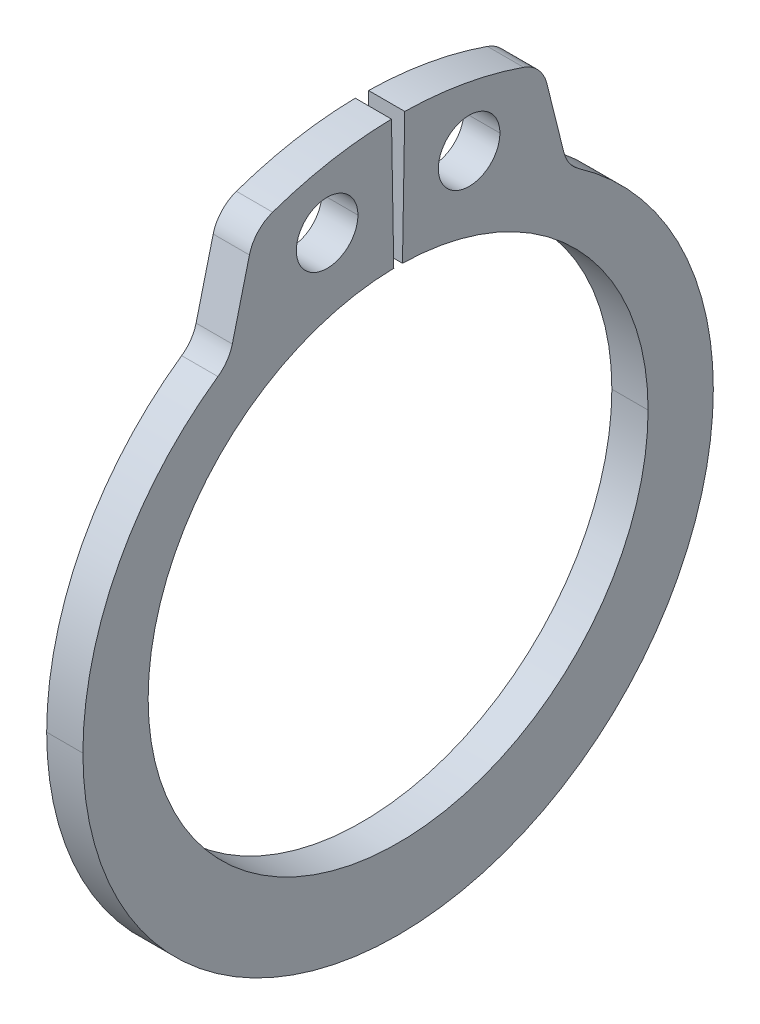
ISO-10303-21;
HEADER;
FILE_DESCRIPTION(('STEP AP214'),'2;1');
FILE_NAME('part.step','',(''),(''),'','','');
FILE_SCHEMA(('AUTOMOTIVE_DESIGN { 1 0 10303 214 1 1 1 1 }'));
ENDSEC;
DATA;
#1=APPLICATION_CONTEXT('core data for automotive mechanical design processes');
#2=APPLICATION_PROTOCOL_DEFINITION('international standard','automotive_design',2000,#1);
#3=PRODUCT_CONTEXT('',#1,'mechanical');
#4=PRODUCT('Part','Part','',(#3));
#5=PRODUCT_RELATED_PRODUCT_CATEGORY('part','',(#4));
#6=PRODUCT_DEFINITION_FORMATION('','',#4);
#7=PRODUCT_DEFINITION_CONTEXT('part definition',#1,'design');
#8=PRODUCT_DEFINITION('design','',#6,#7);
#9=PRODUCT_DEFINITION_SHAPE('','',#8);
#10=(LENGTH_UNIT() NAMED_UNIT(*) SI_UNIT(.MILLI.,.METRE.));
#11=(NAMED_UNIT(*) PLANE_ANGLE_UNIT() SI_UNIT($,.RADIAN.));
#12=(NAMED_UNIT(*) SI_UNIT($,.STERADIAN.) SOLID_ANGLE_UNIT());
#13=UNCERTAINTY_MEASURE_WITH_UNIT(LENGTH_MEASURE(1.E-05),#10,'distance_accuracy_value','');
#14=(GEOMETRIC_REPRESENTATION_CONTEXT(3) GLOBAL_UNCERTAINTY_ASSIGNED_CONTEXT((#13)) GLOBAL_UNIT_ASSIGNED_CONTEXT((#10,
#11,#12)) REPRESENTATION_CONTEXT('',''));
#15=CARTESIAN_POINT('',(0.,0.,0.));
#16=DIRECTION('',(0.,0.,1.));
#17=DIRECTION('',(1.,0.,0.));
#18=AXIS2_PLACEMENT_3D('',#15,#16,#17);
#19=CARTESIAN_POINT('',(0.5,7.55953720484558,-5.54645551751437));
#20=DIRECTION('',(-1.,0.,0.));
#21=DIRECTION('',(0.,0.,1.));
#22=AXIS2_PLACEMENT_3D('',#19,#20,#21);
#23=CYLINDRICAL_SURFACE('',#22,1.);
#24=CARTESIAN_POINT('',(0.5,7.55953720484558,-5.54645551751437));
#25=DIRECTION('',(-1.,0.,0.));
#26=DIRECTION('',(0.,0.,-1.));
#27=AXIS2_PLACEMENT_3D('',#24,#25,#26);
#28=CIRCLE('',#27,1.);
#29=CARTESIAN_POINT('',(0.5,6.73911195964234,-4.97470170945254));
#30=VERTEX_POINT('',#29);
#31=CARTESIAN_POINT('',(0.5,7.31761530924591,-4.57615979123837));
#32=VERTEX_POINT('',#31);
#33=EDGE_CURVE('E233',#30,#32,#28,.T.);
#34=ORIENTED_EDGE('',*,*,#33,.F.);
#35=DIRECTION('',(1.,0.,0.));
#36=VECTOR('',#35,1.);
#37=CARTESIAN_POINT('',(0.5,6.73911195964234,-4.97470170945254));
#38=LINE('',#37,#36);
#39=CARTESIAN_POINT('',(-0.5,6.73911195964234,-4.97470170945254));
#40=VERTEX_POINT('',#39);
#41=EDGE_CURVE('E393',#40,#30,#38,.T.);
#42=ORIENTED_EDGE('',*,*,#41,.F.);
#43=CARTESIAN_POINT('',(-0.5,7.55953720484558,-5.54645551751437));
#44=DIRECTION('',(1.,0.,0.));
#45=DIRECTION('',(0.,0.,-1.));
#46=AXIS2_PLACEMENT_3D('',#43,#44,#45);
#47=CIRCLE('',#46,1.);
#48=CARTESIAN_POINT('',(-0.5,7.31761530924591,-4.57615979123837));
#49=VERTEX_POINT('',#48);
#50=EDGE_CURVE('E257',#49,#40,#47,.T.);
#51=ORIENTED_EDGE('',*,*,#50,.F.);
#52=DIRECTION('',(-1.,0.,0.));
#53=VECTOR('',#52,1.);
#54=CARTESIAN_POINT('',(-0.5,7.31761530924592,-4.57615979123837));
#55=LINE('',#54,#53);
#56=EDGE_CURVE('E212',#32,#49,#55,.T.);
#57=ORIENTED_EDGE('',*,*,#56,.F.);
#58=EDGE_LOOP('',(#34,#42,#51,#57));
#59=FACE_BOUND('',#58,.T.);
#60=ADVANCED_FACE('F16',(#59),#23,.F.);
#61=CARTESIAN_POINT('',(0.5,8.96816184312503,-3.13401869099666));
#62=DIRECTION('',(-1.,0.,0.));
#63=DIRECTION('',(0.,0.,1.));
#64=AXIS2_PLACEMENT_3D('',#61,#62,#63);
#65=CYLINDRICAL_SURFACE('',#64,1.);
#66=CARTESIAN_POINT('',(0.5,8.96816184312503,-3.13401869099666));
#67=DIRECTION('',(1.,0.,0.));
#68=DIRECTION('',(0.,0.,-1.));
#69=AXIS2_PLACEMENT_3D('',#66,#67,#68);
#70=CIRCLE('',#69,1.);
#71=CARTESIAN_POINT('',(0.5,9.21008373872469,-4.10431441727265));
#72=VERTEX_POINT('',#71);
#73=CARTESIAN_POINT('',(0.5,9.91217887924345,-3.46391539531209));
#74=VERTEX_POINT('',#73);
#75=EDGE_CURVE('E204',#72,#74,#70,.T.);
#76=ORIENTED_EDGE('',*,*,#75,.F.);
#77=DIRECTION('',(1.,0.,0.));
#78=VECTOR('',#77,1.);
#79=CARTESIAN_POINT('',(0.5,9.21008373872469,-4.10431441727265));
#80=LINE('',#79,#78);
#81=CARTESIAN_POINT('',(-0.5,9.21008373872469,-4.10431441727265));
#82=VERTEX_POINT('',#81);
#83=EDGE_CURVE('E320',#82,#72,#80,.T.);
#84=ORIENTED_EDGE('',*,*,#83,.F.);
#85=CARTESIAN_POINT('',(-0.5,8.96816184312503,-3.13401869099666));
#86=DIRECTION('',(-1.,0.,0.));
#87=DIRECTION('',(0.,0.,-1.));
#88=AXIS2_PLACEMENT_3D('',#85,#86,#87);
#89=CIRCLE('',#88,1.);
#90=CARTESIAN_POINT('',(-0.5,9.91217887924345,-3.46391539531209));
#91=VERTEX_POINT('',#90);
#92=EDGE_CURVE('E207',#91,#82,#89,.T.);
#93=ORIENTED_EDGE('',*,*,#92,.F.);
#94=DIRECTION('',(-1.,0.,0.));
#95=VECTOR('',#94,1.);
#96=CARTESIAN_POINT('',(0.5,9.91217887924345,-3.46391539531209));
#97=LINE('',#96,#95);
#98=EDGE_CURVE('E27',#74,#91,#97,.T.);
#99=ORIENTED_EDGE('',*,*,#98,.F.);
#100=EDGE_LOOP('',(#76,#84,#93,#99));
#101=FACE_BOUND('',#100,.T.);
#102=ADVANCED_FACE('F202',(#101),#65,.T.);
#103=CARTESIAN_POINT('',(0.5,8.96816184312503,3.13401869099666));
#104=DIRECTION('',(-1.,0.,0.));
#105=DIRECTION('',(0.,0.,1.));
#106=AXIS2_PLACEMENT_3D('',#103,#104,#105);
#107=CYLINDRICAL_SURFACE('',#106,1.);
#108=CARTESIAN_POINT('',(0.5,8.96816184312503,3.13401869099666));
#109=DIRECTION('',(1.,0.,0.));
#110=DIRECTION('',(0.,0.,-1.));
#111=AXIS2_PLACEMENT_3D('',#108,#109,#110);
#112=CIRCLE('',#111,1.);
#113=CARTESIAN_POINT('',(0.5,9.91217887924345,3.46391539531209));
#114=VERTEX_POINT('',#113);
#115=CARTESIAN_POINT('',(0.5,9.21008373872469,4.10431441727265));
#116=VERTEX_POINT('',#115);
#117=EDGE_CURVE('E264',#114,#116,#112,.T.);
#118=ORIENTED_EDGE('',*,*,#117,.F.);
#119=DIRECTION('',(1.,0.,0.));
#120=VECTOR('',#119,1.);
#121=CARTESIAN_POINT('',(0.5,9.91217887924345,3.46391539531209));
#122=LINE('',#121,#120);
#123=CARTESIAN_POINT('',(-0.5,9.91217887924345,3.46391539531209));
#124=VERTEX_POINT('',#123);
#125=EDGE_CURVE('E327',#124,#114,#122,.T.);
#126=ORIENTED_EDGE('',*,*,#125,.F.);
#127=CARTESIAN_POINT('',(-0.5,8.96816184312503,3.13401869099666));
#128=DIRECTION('',(-1.,0.,0.));
#129=DIRECTION('',(0.,0.,-1.));
#130=AXIS2_PLACEMENT_3D('',#127,#128,#129);
#131=CIRCLE('',#130,1.);
#132=CARTESIAN_POINT('',(-0.5,9.21008373872469,4.10431441727265));
#133=VERTEX_POINT('',#132);
#134=EDGE_CURVE('E272',#133,#124,#131,.T.);
#135=ORIENTED_EDGE('',*,*,#134,.F.);
#136=DIRECTION('',(-1.,0.,0.));
#137=VECTOR('',#136,1.);
#138=CARTESIAN_POINT('',(0.5,9.21008373872469,4.10431441727265));
#139=LINE('',#138,#137);
#140=EDGE_CURVE('E161',#116,#133,#139,.T.);
#141=ORIENTED_EDGE('',*,*,#140,.F.);
#142=EDGE_LOOP('',(#118,#126,#135,#141));
#143=FACE_BOUND('',#142,.T.);
#144=ADVANCED_FACE('F664',(#143),#107,.T.);
#145=CARTESIAN_POINT('',(0.5,7.55953720484558,5.54645551751436));
#146=DIRECTION('',(-1.,0.,0.));
#147=DIRECTION('',(0.,0.,1.));
#148=AXIS2_PLACEMENT_3D('',#145,#146,#147);
#149=CYLINDRICAL_SURFACE('',#148,1.);
#150=CARTESIAN_POINT('',(0.5,7.55953720484558,5.54645551751436));
#151=DIRECTION('',(-1.,0.,0.));
#152=DIRECTION('',(0.,0.,-1.));
#153=AXIS2_PLACEMENT_3D('',#150,#151,#152);
#154=CIRCLE('',#153,1.);
#155=CARTESIAN_POINT('',(0.5,7.31761530924592,4.57615979123836));
#156=VERTEX_POINT('',#155);
#157=CARTESIAN_POINT('',(0.5,6.73911195964234,4.97470170945253));
#158=VERTEX_POINT('',#157);
#159=EDGE_CURVE('E336',#156,#158,#154,.T.);
#160=ORIENTED_EDGE('',*,*,#159,.F.);
#161=DIRECTION('',(1.,0.,0.));
#162=VECTOR('',#161,1.);
#163=CARTESIAN_POINT('',(0.5,7.31761530924592,4.57615979123836));
#164=LINE('',#163,#162);
#165=CARTESIAN_POINT('',(-0.5,7.31761530924592,4.57615979123836));
#166=VERTEX_POINT('',#165);
#167=EDGE_CURVE('E324',#166,#156,#164,.T.);
#168=ORIENTED_EDGE('',*,*,#167,.F.);
#169=CARTESIAN_POINT('',(-0.5,7.55953720484558,5.54645551751436));
#170=DIRECTION('',(1.,0.,0.));
#171=DIRECTION('',(0.,0.,-1.));
#172=AXIS2_PLACEMENT_3D('',#169,#170,#171);
#173=CIRCLE('',#172,1.);
#174=CARTESIAN_POINT('',(-0.5,6.73911195964234,4.97470170945253));
#175=VERTEX_POINT('',#174);
#176=EDGE_CURVE('E256',#175,#166,#173,.T.);
#177=ORIENTED_EDGE('',*,*,#176,.F.);
#178=DIRECTION('',(-1.,0.,0.));
#179=VECTOR('',#178,1.);
#180=CARTESIAN_POINT('',(0.5,6.73911195964234,4.97470170945253));
#181=LINE('',#180,#179);
#182=EDGE_CURVE('E42',#158,#175,#181,.T.);
#183=ORIENTED_EDGE('',*,*,#182,.F.);
#184=EDGE_LOOP('',(#160,#168,#177,#183));
#185=FACE_BOUND('',#184,.T.);
#186=ADVANCED_FACE('F659',(#185),#149,.F.);
#187=CARTESIAN_POINT('',(0.5,8.66711980549087,-1.9596288316201));
#188=DIRECTION('',(-1.,0.,0.));
#189=DIRECTION('',(0.,0.,1.));
#190=AXIS2_PLACEMENT_3D('',#187,#188,#189);
#191=CYLINDRICAL_SURFACE('',#190,0.85);
#192=DIRECTION('',(-1.,0.,0.));
#193=VECTOR('',#192,1.);
#194=CARTESIAN_POINT('',(0.5,8.66711980549087,-2.8096288316201));
#195=LINE('',#194,#193);
#196=CARTESIAN_POINT('',(0.5,8.66711980549087,-2.8096288316201));
#197=VERTEX_POINT('',#196);
#198=CARTESIAN_POINT('',(-0.5,8.66711980549087,-2.8096288316201));
#199=VERTEX_POINT('',#198);
#200=EDGE_CURVE('E332',#197,#199,#195,.T.);
#201=ORIENTED_EDGE('',*,*,#200,.F.);
#202=CARTESIAN_POINT('',(0.5,8.66711980549087,-1.9596288316201));
#203=DIRECTION('',(1.,0.,0.));
#204=DIRECTION('',(0.,0.,-1.));
#205=AXIS2_PLACEMENT_3D('',#202,#203,#204);
#206=CIRCLE('',#205,0.85);
#207=CARTESIAN_POINT('',(0.5,8.66711980549087,-1.1096288316201));
#208=VERTEX_POINT('',#207);
#209=EDGE_CURVE('E273',#197,#208,#206,.T.);
#210=ORIENTED_EDGE('',*,*,#209,.T.);
#211=DIRECTION('',(-1.,0.,0.));
#212=VECTOR('',#211,1.);
#213=CARTESIAN_POINT('',(0.5,8.66711980549087,-1.1096288316201));
#214=LINE('',#213,#212);
#215=CARTESIAN_POINT('',(-0.5,8.66711980549087,-1.1096288316201));
#216=VERTEX_POINT('',#215);
#217=EDGE_CURVE('E258',#208,#216,#214,.T.);
#218=ORIENTED_EDGE('',*,*,#217,.T.);
#219=CARTESIAN_POINT('',(-0.5,8.66711980549087,-1.9596288316201));
#220=DIRECTION('',(1.,0.,0.));
#221=DIRECTION('',(0.,0.,-1.));
#222=AXIS2_PLACEMENT_3D('',#219,#220,#221);
#223=CIRCLE('',#222,0.85);
#224=EDGE_CURVE('E349',#199,#216,#223,.T.);
#225=ORIENTED_EDGE('',*,*,#224,.F.);
#226=EDGE_LOOP('',(#201,#210,#218,#225));
#227=FACE_BOUND('',#226,.T.);
#228=ADVANCED_FACE('F663',(#227),#191,.F.);
#229=CARTESIAN_POINT('',(0.5,8.66711980549087,1.9596288316201));
#230=DIRECTION('',(-1.,0.,0.));
#231=DIRECTION('',(0.,0.,1.));
#232=AXIS2_PLACEMENT_3D('',#229,#230,#231);
#233=CYLINDRICAL_SURFACE('',#232,0.85);
#234=DIRECTION('',(-1.,0.,0.));
#235=VECTOR('',#234,1.);
#236=CARTESIAN_POINT('',(0.5,8.66711980549087,1.1096288316201));
#237=LINE('',#236,#235);
#238=CARTESIAN_POINT('',(0.5,8.66711980549087,1.1096288316201));
#239=VERTEX_POINT('',#238);
#240=CARTESIAN_POINT('',(-0.5,8.66711980549087,1.1096288316201));
#241=VERTEX_POINT('',#240);
#242=EDGE_CURVE('E277',#239,#241,#237,.T.);
#243=ORIENTED_EDGE('',*,*,#242,.F.);
#244=CARTESIAN_POINT('',(0.5,8.66711980549087,1.9596288316201));
#245=DIRECTION('',(1.,0.,0.));
#246=DIRECTION('',(0.,0.,-1.));
#247=AXIS2_PLACEMENT_3D('',#244,#245,#246);
#248=CIRCLE('',#247,0.85);
#249=CARTESIAN_POINT('',(0.5,8.66711980549087,2.8096288316201));
#250=VERTEX_POINT('',#249);
#251=EDGE_CURVE('E323',#239,#250,#248,.T.);
#252=ORIENTED_EDGE('',*,*,#251,.T.);
#253=DIRECTION('',(-1.,0.,0.));
#254=VECTOR('',#253,1.);
#255=CARTESIAN_POINT('',(0.5,8.66711980549087,2.8096288316201));
#256=LINE('',#255,#254);
#257=CARTESIAN_POINT('',(-0.5,8.66711980549087,2.8096288316201));
#258=VERTEX_POINT('',#257);
#259=EDGE_CURVE('E247',#250,#258,#256,.T.);
#260=ORIENTED_EDGE('',*,*,#259,.T.);
#261=CARTESIAN_POINT('',(-0.5,8.66711980549087,1.9596288316201));
#262=DIRECTION('',(1.,0.,0.));
#263=DIRECTION('',(0.,0.,-1.));
#264=AXIS2_PLACEMENT_3D('',#261,#262,#263);
#265=CIRCLE('',#264,0.85);
#266=EDGE_CURVE('E361',#241,#258,#265,.T.);
#267=ORIENTED_EDGE('',*,*,#266,.F.);
#268=EDGE_LOOP('',(#243,#252,#260,#267));
#269=FACE_BOUND('',#268,.T.);
#270=ADVANCED_FACE('F680',(#269),#233,.F.);
#271=CARTESIAN_POINT('',(0.5,10.4984007991421,-0.183250267591479));
#272=DIRECTION('',(0.,-0.017452406437284,-0.999847695156391));
#273=DIRECTION('',(0.,-0.999847695156391,0.017452406437284));
#274=AXIS2_PLACEMENT_3D('',#271,#272,#273);
#275=PLANE('',#274);
#276=DIRECTION('',(0.,-0.999847695156391,0.017452406437284));
#277=VECTOR('',#276,1.);
#278=CARTESIAN_POINT('',(-0.5,10.4984007991421,-0.183250267591479));
#279=LINE('',#278,#277);
#280=CARTESIAN_POINT('',(-0.5,10.4984007991421,-0.183250267591479));
#281=VERTEX_POINT('',#280);
#282=CARTESIAN_POINT('',(-0.5,6.8989490965791,-0.120421604417257));
#283=VERTEX_POINT('',#282);
#284=EDGE_CURVE('E246',#281,#283,#279,.T.);
#285=ORIENTED_EDGE('',*,*,#284,.T.);
#286=DIRECTION('',(-1.,0.,0.));
#287=VECTOR('',#286,1.);
#288=CARTESIAN_POINT('',(0.5,6.8989490965791,-0.120421604417257));
#289=LINE('',#288,#287);
#290=CARTESIAN_POINT('',(0.5,6.8989490965791,-0.120421604417257));
#291=VERTEX_POINT('',#290);
#292=EDGE_CURVE('E174',#291,#283,#289,.T.);
#293=ORIENTED_EDGE('',*,*,#292,.F.);
#294=DIRECTION('',(0.,-0.999847695156391,0.017452406437284));
#295=VECTOR('',#294,1.);
#296=CARTESIAN_POINT('',(0.5,10.4984007991421,-0.183250267591479));
#297=LINE('',#296,#295);
#298=CARTESIAN_POINT('',(0.5,10.4984007991421,-0.183250267591479));
#299=VERTEX_POINT('',#298);
#300=EDGE_CURVE('E220',#299,#291,#297,.T.);
#301=ORIENTED_EDGE('',*,*,#300,.F.);
#302=DIRECTION('',(-1.,0.,0.));
#303=VECTOR('',#302,1.);
#304=CARTESIAN_POINT('',(0.5,10.4984007991421,-0.183250267591479));
#305=LINE('',#304,#303);
#306=EDGE_CURVE('E11',#299,#281,#305,.T.);
#307=ORIENTED_EDGE('',*,*,#306,.T.);
#308=EDGE_LOOP('',(#285,#293,#301,#307));
#309=FACE_BOUND('',#308,.T.);
#310=ADVANCED_FACE('F689',(#309),#275,.F.);
#311=CARTESIAN_POINT('',(0.5,0.,0.));
#312=DIRECTION('',(-1.,0.,0.));
#313=DIRECTION('',(0.,0.,1.));
#314=AXIS2_PLACEMENT_3D('',#311,#312,#313);
#315=CYLINDRICAL_SURFACE('',#314,10.5);
#316=CARTESIAN_POINT('',(0.5,0.,0.));
#317=DIRECTION('',(1.,0.,0.));
#318=DIRECTION('',(0.,0.,1.));
#319=AXIS2_PLACEMENT_3D('',#316,#317,#318);
#320=CIRCLE('',#319,10.5);
#321=EDGE_CURVE('E215',#74,#299,#320,.T.);
#322=ORIENTED_EDGE('',*,*,#321,.F.);
#323=ORIENTED_EDGE('',*,*,#98,.T.);
#324=CARTESIAN_POINT('',(-0.5,0.,0.));
#325=DIRECTION('',(1.,0.,0.));
#326=DIRECTION('',(0.,0.,1.));
#327=AXIS2_PLACEMENT_3D('',#324,#325,#326);
#328=CIRCLE('',#327,10.5);
#329=EDGE_CURVE('E370',#91,#281,#328,.T.);
#330=ORIENTED_EDGE('',*,*,#329,.T.);
#331=ORIENTED_EDGE('',*,*,#306,.F.);
#332=EDGE_LOOP('',(#322,#323,#330,#331));
#333=FACE_BOUND('',#332,.T.);
#334=ADVANCED_FACE('F216',(#333),#315,.T.);
#335=CARTESIAN_POINT('',(0.5,9.7173447274592,-3.97784004803122));
#336=DIRECTION('',(0.,-0.241921895599666,0.970295726275997));
#337=DIRECTION('',(-1.,0.,0.));
#338=AXIS2_PLACEMENT_3D('',#335,#336,#337);
#339=PLANE('',#338);
#340=DIRECTION('',(0.,0.970295726275997,0.241921895599666));
#341=VECTOR('',#340,1.);
#342=CARTESIAN_POINT('',(-0.5,9.7173447274592,-3.97784004803122));
#343=LINE('',#342,#341);
#344=EDGE_CURVE('E354',#49,#82,#343,.T.);
#345=ORIENTED_EDGE('',*,*,#344,.T.);
#346=ORIENTED_EDGE('',*,*,#83,.T.);
#347=DIRECTION('',(0.,0.970295726275997,0.241921895599666));
#348=VECTOR('',#347,1.);
#349=CARTESIAN_POINT('',(0.5,9.7173447274592,-3.97784004803122));
#350=LINE('',#349,#348);
#351=EDGE_CURVE('E225',#32,#72,#350,.T.);
#352=ORIENTED_EDGE('',*,*,#351,.F.);
#353=ORIENTED_EDGE('',*,*,#56,.T.);
#354=EDGE_LOOP('',(#345,#346,#352,#353));
#355=FACE_BOUND('',#354,.T.);
#356=ADVANCED_FACE('F643',(#355),#339,.F.);
#357=CARTESIAN_POINT('',(0.5,-0.399224177769539,0.));
#358=DIRECTION('',(-1.,0.,0.));
#359=DIRECTION('',(0.,0.,1.));
#360=AXIS2_PLACEMENT_3D('',#357,#358,#359);
#361=CYLINDRICAL_SURFACE('',#360,8.70077582223047);
#362=DIRECTION('',(-1.,0.,0.));
#363=VECTOR('',#362,1.);
#364=CARTESIAN_POINT('',(0.5,-0.399224177769539,8.70077582223047));
#365=LINE('',#364,#363);
#366=CARTESIAN_POINT('',(0.5,-0.399224177769539,8.70077582223046));
#367=VERTEX_POINT('',#366);
#368=CARTESIAN_POINT('',(-0.5,-0.399224177769539,8.70077582223046));
#369=VERTEX_POINT('',#368);
#370=EDGE_CURVE('E301',#367,#369,#365,.T.);
#371=ORIENTED_EDGE('',*,*,#370,.F.);
#372=CARTESIAN_POINT('',(0.5,-0.399224177769539,0.));
#373=DIRECTION('',(1.,0.,0.));
#374=DIRECTION('',(0.,0.,-1.));
#375=AXIS2_PLACEMENT_3D('',#372,#373,#374);
#376=CIRCLE('',#375,8.70077582223047);
#377=EDGE_CURVE('E340',#158,#367,#376,.T.);
#378=ORIENTED_EDGE('',*,*,#377,.F.);
#379=ORIENTED_EDGE('',*,*,#182,.T.);
#380=CARTESIAN_POINT('',(-0.5,-0.399224177769539,0.));
#381=DIRECTION('',(1.,0.,0.));
#382=DIRECTION('',(0.,0.,-1.));
#383=AXIS2_PLACEMENT_3D('',#380,#381,#382);
#384=CIRCLE('',#383,8.70077582223047);
#385=EDGE_CURVE('E253',#175,#369,#384,.T.);
#386=ORIENTED_EDGE('',*,*,#385,.T.);
#387=EDGE_LOOP('',(#371,#378,#379,#386));
#388=FACE_BOUND('',#387,.T.);
#389=ADVANCED_FACE('F638',(#388),#361,.T.);
#390=CARTESIAN_POINT('',(0.5,9.7173447274592,3.97784004803122));
#391=DIRECTION('',(0.,-0.241921895599666,-0.970295726275997));
#392=DIRECTION('',(0.,-0.970295726275997,0.241921895599666));
#393=AXIS2_PLACEMENT_3D('',#390,#391,#392);
#394=PLANE('',#393);
#395=DIRECTION('',(0.,-0.970295726275997,0.241921895599666));
#396=VECTOR('',#395,1.);
#397=CARTESIAN_POINT('',(-0.5,9.7173447274592,3.97784004803122));
#398=LINE('',#397,#396);
#399=EDGE_CURVE('E269',#133,#166,#398,.T.);
#400=ORIENTED_EDGE('',*,*,#399,.T.);
#401=ORIENTED_EDGE('',*,*,#167,.T.);
#402=DIRECTION('',(0.,-0.970295726275997,0.241921895599666));
#403=VECTOR('',#402,1.);
#404=CARTESIAN_POINT('',(0.5,9.7173447274592,3.97784004803122));
#405=LINE('',#404,#403);
#406=EDGE_CURVE('E237',#116,#156,#405,.T.);
#407=ORIENTED_EDGE('',*,*,#406,.F.);
#408=ORIENTED_EDGE('',*,*,#140,.T.);
#409=EDGE_LOOP('',(#400,#401,#407,#408));
#410=FACE_BOUND('',#409,.T.);
#411=ADVANCED_FACE('F634',(#410),#394,.F.);
#412=CARTESIAN_POINT('',(0.5,0.,0.));
#413=DIRECTION('',(-1.,0.,0.));
#414=DIRECTION('',(0.,0.,1.));
#415=AXIS2_PLACEMENT_3D('',#412,#413,#414);
#416=CYLINDRICAL_SURFACE('',#415,10.5);
#417=CARTESIAN_POINT('',(-0.5,0.,0.));
#418=DIRECTION('',(1.,0.,0.));
#419=DIRECTION('',(0.,0.,-1.));
#420=AXIS2_PLACEMENT_3D('',#417,#418,#419);
#421=CIRCLE('',#420,10.5);
#422=CARTESIAN_POINT('',(-0.5,10.4984007991421,0.183250267591478));
#423=VERTEX_POINT('',#422);
#424=EDGE_CURVE('E243',#423,#124,#421,.T.);
#425=ORIENTED_EDGE('',*,*,#424,.T.);
#426=ORIENTED_EDGE('',*,*,#125,.T.);
#427=CARTESIAN_POINT('',(0.5,0.,0.));
#428=DIRECTION('',(1.,0.,0.));
#429=DIRECTION('',(0.,0.,-1.));
#430=AXIS2_PLACEMENT_3D('',#427,#428,#429);
#431=CIRCLE('',#430,10.5);
#432=CARTESIAN_POINT('',(0.5,10.4984007991421,0.183250267591478));
#433=VERTEX_POINT('',#432);
#434=EDGE_CURVE('E268',#433,#114,#431,.T.);
#435=ORIENTED_EDGE('',*,*,#434,.F.);
#436=DIRECTION('',(-1.,0.,0.));
#437=VECTOR('',#436,1.);
#438=CARTESIAN_POINT('',(0.5,10.4984007991421,0.183250267591478));
#439=LINE('',#438,#437);
#440=EDGE_CURVE('E348',#433,#423,#439,.T.);
#441=ORIENTED_EDGE('',*,*,#440,.T.);
#442=EDGE_LOOP('',(#425,#426,#435,#441));
#443=FACE_BOUND('',#442,.T.);
#444=ADVANCED_FACE('F445',(#443),#416,.T.);
#445=CARTESIAN_POINT('',(0.5,6.8989490965791,0.120421604417256));
#446=DIRECTION('',(0.,-0.0174524064372836,0.999847695156391));
#447=DIRECTION('',(-1.,0.,0.));
#448=AXIS2_PLACEMENT_3D('',#445,#446,#447);
#449=PLANE('',#448);
#450=DIRECTION('',(0.,0.999847695156391,0.0174524064372836));
#451=VECTOR('',#450,1.);
#452=CARTESIAN_POINT('',(-0.5,6.8989490965791,0.120421604417256));
#453=LINE('',#452,#451);
#454=CARTESIAN_POINT('',(-0.5,6.8989490965791,0.120421604417256));
#455=VERTEX_POINT('',#454);
#456=EDGE_CURVE('E239',#455,#423,#453,.T.);
#457=ORIENTED_EDGE('',*,*,#456,.T.);
#458=ORIENTED_EDGE('',*,*,#440,.F.);
#459=DIRECTION('',(0.,0.999847695156391,0.0174524064372836));
#460=VECTOR('',#459,1.);
#461=CARTESIAN_POINT('',(0.5,6.8989490965791,0.120421604417256));
#462=LINE('',#461,#460);
#463=CARTESIAN_POINT('',(0.5,6.8989490965791,0.120421604417256));
#464=VERTEX_POINT('',#463);
#465=EDGE_CURVE('E343',#464,#433,#462,.T.);
#466=ORIENTED_EDGE('',*,*,#465,.F.);
#467=DIRECTION('',(-1.,0.,0.));
#468=VECTOR('',#467,1.);
#469=CARTESIAN_POINT('',(0.5,6.8989490965791,0.120421604417256));
#470=LINE('',#469,#468);
#471=EDGE_CURVE('E276',#464,#455,#470,.T.);
#472=ORIENTED_EDGE('',*,*,#471,.T.);
#473=EDGE_LOOP('',(#457,#458,#466,#472));
#474=FACE_BOUND('',#473,.T.);
#475=ADVANCED_FACE('F441',(#474),#449,.F.);
#476=CARTESIAN_POINT('',(0.5,0.,0.));
#477=DIRECTION('',(-1.,0.,0.));
#478=DIRECTION('',(0.,0.,1.));
#479=AXIS2_PLACEMENT_3D('',#476,#477,#478);
#480=CYLINDRICAL_SURFACE('',#479,6.9);
#481=DIRECTION('',(-1.,0.,0.));
#482=VECTOR('',#481,1.);
#483=CARTESIAN_POINT('',(0.5,0.,-6.9));
#484=LINE('',#483,#482);
#485=CARTESIAN_POINT('',(0.5,0.,-6.9));
#486=VERTEX_POINT('',#485);
#487=CARTESIAN_POINT('',(-0.5,0.,-6.9));
#488=VERTEX_POINT('',#487);
#489=EDGE_CURVE('E281',#486,#488,#484,.T.);
#490=ORIENTED_EDGE('',*,*,#489,.F.);
#491=CARTESIAN_POINT('',(0.5,0.,0.));
#492=DIRECTION('',(-1.,0.,0.));
#493=DIRECTION('',(0.,0.,-1.));
#494=AXIS2_PLACEMENT_3D('',#491,#492,#493);
#495=CIRCLE('',#494,6.9);
#496=EDGE_CURVE('E294',#291,#486,#495,.T.);
#497=ORIENTED_EDGE('',*,*,#496,.F.);
#498=ORIENTED_EDGE('',*,*,#292,.T.);
#499=CARTESIAN_POINT('',(-0.5,0.,0.));
#500=DIRECTION('',(-1.,0.,0.));
#501=DIRECTION('',(0.,0.,-1.));
#502=AXIS2_PLACEMENT_3D('',#499,#500,#501);
#503=CIRCLE('',#502,6.9);
#504=EDGE_CURVE('E242',#283,#488,#503,.T.);
#505=ORIENTED_EDGE('',*,*,#504,.T.);
#506=EDGE_LOOP('',(#490,#497,#498,#505));
#507=FACE_BOUND('',#506,.T.);
#508=ADVANCED_FACE('F18',(#507),#480,.F.);
#509=CARTESIAN_POINT('',(-0.5,0.,0.));
#510=DIRECTION('',(1.,0.,0.));
#511=DIRECTION('',(0.,-1.,0.));
#512=AXIS2_PLACEMENT_3D('',#509,#510,#511);
#513=PLANE('',#512);
#514=CARTESIAN_POINT('',(-0.5,8.66711980549087,-1.9596288316201));
#515=DIRECTION('',(1.,0.,0.));
#516=DIRECTION('',(0.,0.,-1.));
#517=AXIS2_PLACEMENT_3D('',#514,#515,#516);
#518=CIRCLE('',#517,0.85);
#519=EDGE_CURVE('E263',#216,#199,#518,.T.);
#520=ORIENTED_EDGE('',*,*,#519,.T.);
#521=ORIENTED_EDGE('',*,*,#224,.T.);
#522=EDGE_LOOP('',(#520,#521));
#523=FACE_BOUND('',#522,.T.);
#524=CARTESIAN_POINT('',(-0.5,8.66711980549087,1.9596288316201));
#525=DIRECTION('',(1.,0.,0.));
#526=DIRECTION('',(0.,0.,-1.));
#527=AXIS2_PLACEMENT_3D('',#524,#525,#526);
#528=CIRCLE('',#527,0.85);
#529=EDGE_CURVE('E252',#258,#241,#528,.T.);
#530=ORIENTED_EDGE('',*,*,#529,.T.);
#531=ORIENTED_EDGE('',*,*,#266,.T.);
#532=EDGE_LOOP('',(#530,#531));
#533=FACE_BOUND('',#532,.T.);
#534=ORIENTED_EDGE('',*,*,#399,.F.);
#535=ORIENTED_EDGE('',*,*,#134,.T.);
#536=ORIENTED_EDGE('',*,*,#424,.F.);
#537=ORIENTED_EDGE('',*,*,#456,.F.);
#538=CARTESIAN_POINT('',(-0.5,0.,0.));
#539=DIRECTION('',(-1.,0.,0.));
#540=DIRECTION('',(0.,0.,-1.));
#541=AXIS2_PLACEMENT_3D('',#538,#539,#540);
#542=CIRCLE('',#541,6.9);
#543=CARTESIAN_POINT('',(-0.5,0.,6.9));
#544=VERTEX_POINT('',#543);
#545=EDGE_CURVE('E20',#544,#455,#542,.T.);
#546=ORIENTED_EDGE('',*,*,#545,.F.);
#547=CARTESIAN_POINT('',(-0.5,0.,0.));
#548=DIRECTION('',(-1.,0.,0.));
#549=DIRECTION('',(0.,0.,-1.));
#550=AXIS2_PLACEMENT_3D('',#547,#548,#549);
#551=CIRCLE('',#550,6.9);
#552=EDGE_CURVE('E285',#488,#544,#551,.T.);
#553=ORIENTED_EDGE('',*,*,#552,.F.);
#554=ORIENTED_EDGE('',*,*,#504,.F.);
#555=ORIENTED_EDGE('',*,*,#284,.F.);
#556=ORIENTED_EDGE('',*,*,#329,.F.);
#557=ORIENTED_EDGE('',*,*,#92,.T.);
#558=ORIENTED_EDGE('',*,*,#344,.F.);
#559=ORIENTED_EDGE('',*,*,#50,.T.);
#560=CARTESIAN_POINT('',(-0.5,-0.399224177769539,0.));
#561=DIRECTION('',(1.,0.,0.));
#562=DIRECTION('',(0.,0.,-1.));
#563=AXIS2_PLACEMENT_3D('',#560,#561,#562);
#564=CIRCLE('',#563,8.70077582223047);
#565=CARTESIAN_POINT('',(-0.5,-0.399224177769538,-8.70077582223046));
#566=VERTEX_POINT('',#565);
#567=EDGE_CURVE('E384',#566,#40,#564,.T.);
#568=ORIENTED_EDGE('',*,*,#567,.F.);
#569=CARTESIAN_POINT('',(-0.5,-0.399224177769539,0.));
#570=DIRECTION('',(1.,0.,0.));
#571=DIRECTION('',(0.,0.,-1.));
#572=AXIS2_PLACEMENT_3D('',#569,#570,#571);
#573=CIRCLE('',#572,8.70077582223047);
#574=EDGE_CURVE('E298',#369,#566,#573,.T.);
#575=ORIENTED_EDGE('',*,*,#574,.F.);
#576=ORIENTED_EDGE('',*,*,#385,.F.);
#577=ORIENTED_EDGE('',*,*,#176,.T.);
#578=EDGE_LOOP('',(#534,#535,#536,#537,#546,#553,#554,#555,#556,#557,#558,#559,#568,#575,#576,#577));
#579=FACE_BOUND('',#578,.T.);
#580=ADVANCED_FACE('F439',(#523,#533,#579),#513,.F.);
#581=CARTESIAN_POINT('',(0.5,0.,0.));
#582=DIRECTION('',(1.,0.,0.));
#583=DIRECTION('',(0.,-1.,0.));
#584=AXIS2_PLACEMENT_3D('',#581,#582,#583);
#585=PLANE('',#584);
#586=CARTESIAN_POINT('',(0.5,8.66711980549087,-1.9596288316201));
#587=DIRECTION('',(1.,0.,0.));
#588=DIRECTION('',(0.,0.,-1.));
#589=AXIS2_PLACEMENT_3D('',#586,#587,#588);
#590=CIRCLE('',#589,0.85);
#591=EDGE_CURVE('E328',#208,#197,#590,.T.);
#592=ORIENTED_EDGE('',*,*,#591,.F.);
#593=ORIENTED_EDGE('',*,*,#209,.F.);
#594=EDGE_LOOP('',(#592,#593));
#595=FACE_BOUND('',#594,.T.);
#596=CARTESIAN_POINT('',(0.5,8.66711980549087,1.9596288316201));
#597=DIRECTION('',(1.,0.,0.));
#598=DIRECTION('',(0.,0.,-1.));
#599=AXIS2_PLACEMENT_3D('',#596,#597,#598);
#600=CIRCLE('',#599,0.85);
#601=EDGE_CURVE('E262',#250,#239,#600,.T.);
#602=ORIENTED_EDGE('',*,*,#601,.F.);
#603=ORIENTED_EDGE('',*,*,#251,.F.);
#604=EDGE_LOOP('',(#602,#603));
#605=FACE_BOUND('',#604,.T.);
#606=ORIENTED_EDGE('',*,*,#434,.T.);
#607=ORIENTED_EDGE('',*,*,#117,.T.);
#608=ORIENTED_EDGE('',*,*,#406,.T.);
#609=ORIENTED_EDGE('',*,*,#159,.T.);
#610=ORIENTED_EDGE('',*,*,#377,.T.);
#611=CARTESIAN_POINT('',(0.5,-0.399224177769539,0.));
#612=DIRECTION('',(1.,0.,0.));
#613=DIRECTION('',(0.,0.,-1.));
#614=AXIS2_PLACEMENT_3D('',#611,#612,#613);
#615=CIRCLE('',#614,8.70077582223047);
#616=CARTESIAN_POINT('',(0.5,-0.399224177769538,-8.70077582223046));
#617=VERTEX_POINT('',#616);
#618=EDGE_CURVE('E399',#367,#617,#615,.T.);
#619=ORIENTED_EDGE('',*,*,#618,.T.);
#620=CARTESIAN_POINT('',(0.5,-0.399224177769539,0.));
#621=DIRECTION('',(1.,0.,0.));
#622=DIRECTION('',(0.,0.,-1.));
#623=AXIS2_PLACEMENT_3D('',#620,#621,#622);
#624=CIRCLE('',#623,8.70077582223047);
#625=EDGE_CURVE('E251',#617,#30,#624,.T.);
#626=ORIENTED_EDGE('',*,*,#625,.T.);
#627=ORIENTED_EDGE('',*,*,#33,.T.);
#628=ORIENTED_EDGE('',*,*,#351,.T.);
#629=ORIENTED_EDGE('',*,*,#75,.T.);
#630=ORIENTED_EDGE('',*,*,#321,.T.);
#631=ORIENTED_EDGE('',*,*,#300,.T.);
#632=ORIENTED_EDGE('',*,*,#496,.T.);
#633=CARTESIAN_POINT('',(0.5,0.,0.));
#634=DIRECTION('',(-1.,0.,0.));
#635=DIRECTION('',(0.,0.,-1.));
#636=AXIS2_PLACEMENT_3D('',#633,#634,#635);
#637=CIRCLE('',#636,6.9);
#638=CARTESIAN_POINT('',(0.5,0.,6.9));
#639=VERTEX_POINT('',#638);
#640=EDGE_CURVE('E286',#486,#639,#637,.T.);
#641=ORIENTED_EDGE('',*,*,#640,.T.);
#642=CARTESIAN_POINT('',(0.5,0.,0.));
#643=DIRECTION('',(-1.,0.,0.));
#644=DIRECTION('',(0.,0.,-1.));
#645=AXIS2_PLACEMENT_3D('',#642,#643,#644);
#646=CIRCLE('',#645,6.9);
#647=EDGE_CURVE('E287',#639,#464,#646,.T.);
#648=ORIENTED_EDGE('',*,*,#647,.T.);
#649=ORIENTED_EDGE('',*,*,#465,.T.);
#650=EDGE_LOOP('',(#606,#607,#608,#609,#610,#619,#626,#627,#628,#629,#630,#631,#632,#641,#648,#649));
#651=FACE_BOUND('',#650,.T.);
#652=ADVANCED_FACE('F222',(#595,#605,#651),#585,.T.);
#653=CARTESIAN_POINT('',(0.5,0.,0.));
#654=DIRECTION('',(-1.,0.,0.));
#655=DIRECTION('',(0.,0.,1.));
#656=AXIS2_PLACEMENT_3D('',#653,#654,#655);
#657=CYLINDRICAL_SURFACE('',#656,6.9);
#658=ORIENTED_EDGE('',*,*,#647,.F.);
#659=DIRECTION('',(-1.,0.,0.));
#660=VECTOR('',#659,1.);
#661=CARTESIAN_POINT('',(0.5,0.,6.9));
#662=LINE('',#661,#660);
#663=EDGE_CURVE('E291',#639,#544,#662,.T.);
#664=ORIENTED_EDGE('',*,*,#663,.T.);
#665=ORIENTED_EDGE('',*,*,#545,.T.);
#666=ORIENTED_EDGE('',*,*,#471,.F.);
#667=EDGE_LOOP('',(#658,#664,#665,#666));
#668=FACE_BOUND('',#667,.T.);
#669=ADVANCED_FACE('F436',(#668),#657,.F.);
#670=CARTESIAN_POINT('',(0.5,0.,0.));
#671=DIRECTION('',(-1.,0.,0.));
#672=DIRECTION('',(0.,0.,1.));
#673=AXIS2_PLACEMENT_3D('',#670,#671,#672);
#674=CYLINDRICAL_SURFACE('',#673,6.9);
#675=ORIENTED_EDGE('',*,*,#640,.F.);
#676=ORIENTED_EDGE('',*,*,#489,.T.);
#677=ORIENTED_EDGE('',*,*,#552,.T.);
#678=ORIENTED_EDGE('',*,*,#663,.F.);
#679=EDGE_LOOP('',(#675,#676,#677,#678));
#680=FACE_BOUND('',#679,.T.);
#681=ADVANCED_FACE('F621',(#680),#674,.F.);
#682=CARTESIAN_POINT('',(0.5,-0.399224177769539,0.));
#683=DIRECTION('',(-1.,0.,0.));
#684=DIRECTION('',(0.,0.,1.));
#685=AXIS2_PLACEMENT_3D('',#682,#683,#684);
#686=CYLINDRICAL_SURFACE('',#685,8.70077582223047);
#687=DIRECTION('',(-1.,0.,0.));
#688=VECTOR('',#687,1.);
#689=CARTESIAN_POINT('',(0.5,-0.399224177769538,-8.70077582223047));
#690=LINE('',#689,#688);
#691=EDGE_CURVE('E365',#617,#566,#690,.T.);
#692=ORIENTED_EDGE('',*,*,#691,.F.);
#693=ORIENTED_EDGE('',*,*,#618,.F.);
#694=ORIENTED_EDGE('',*,*,#370,.T.);
#695=ORIENTED_EDGE('',*,*,#574,.T.);
#696=EDGE_LOOP('',(#692,#693,#694,#695));
#697=FACE_BOUND('',#696,.T.);
#698=ADVANCED_FACE('F616',(#697),#686,.T.);
#699=CARTESIAN_POINT('',(0.5,-0.399224177769539,0.));
#700=DIRECTION('',(-1.,0.,0.));
#701=DIRECTION('',(0.,0.,1.));
#702=AXIS2_PLACEMENT_3D('',#699,#700,#701);
#703=CYLINDRICAL_SURFACE('',#702,8.70077582223047);
#704=ORIENTED_EDGE('',*,*,#625,.F.);
#705=ORIENTED_EDGE('',*,*,#691,.T.);
#706=ORIENTED_EDGE('',*,*,#567,.T.);
#707=ORIENTED_EDGE('',*,*,#41,.T.);
#708=EDGE_LOOP('',(#704,#705,#706,#707));
#709=FACE_BOUND('',#708,.T.);
#710=ADVANCED_FACE('F620',(#709),#703,.T.);
#711=CARTESIAN_POINT('',(0.5,8.66711980549087,1.9596288316201));
#712=DIRECTION('',(-1.,0.,0.));
#713=DIRECTION('',(0.,0.,1.));
#714=AXIS2_PLACEMENT_3D('',#711,#712,#713);
#715=CYLINDRICAL_SURFACE('',#714,0.85);
#716=ORIENTED_EDGE('',*,*,#601,.T.);
#717=ORIENTED_EDGE('',*,*,#242,.T.);
#718=ORIENTED_EDGE('',*,*,#529,.F.);
#719=ORIENTED_EDGE('',*,*,#259,.F.);
#720=EDGE_LOOP('',(#716,#717,#718,#719));
#721=FACE_BOUND('',#720,.T.);
#722=ADVANCED_FACE('F724',(#721),#715,.F.);
#723=CARTESIAN_POINT('',(0.5,8.66711980549087,-1.9596288316201));
#724=DIRECTION('',(-1.,0.,0.));
#725=DIRECTION('',(0.,0.,1.));
#726=AXIS2_PLACEMENT_3D('',#723,#724,#725);
#727=CYLINDRICAL_SURFACE('',#726,0.85);
#728=ORIENTED_EDGE('',*,*,#591,.T.);
#729=ORIENTED_EDGE('',*,*,#200,.T.);
#730=ORIENTED_EDGE('',*,*,#519,.F.);
#731=ORIENTED_EDGE('',*,*,#217,.F.);
#732=EDGE_LOOP('',(#728,#729,#730,#731));
#733=FACE_BOUND('',#732,.T.);
#734=ADVANCED_FACE('F728',(#733),#727,.F.);
#735=CLOSED_SHELL('',(#60,#102,#144,#186,#228,#270,#310,#334,#356,#389,#411,#444,#475,#508,#580,
#652,#669,#681,#698,#710,#722,#734));
#736=MANIFOLD_SOLID_BREP('B1',#735);
#737=ADVANCED_BREP_SHAPE_REPRESENTATION('',(#18,#736),#14);
#738=SHAPE_DEFINITION_REPRESENTATION(#9,#737);
ENDSEC;
END-ISO-10303-21;
